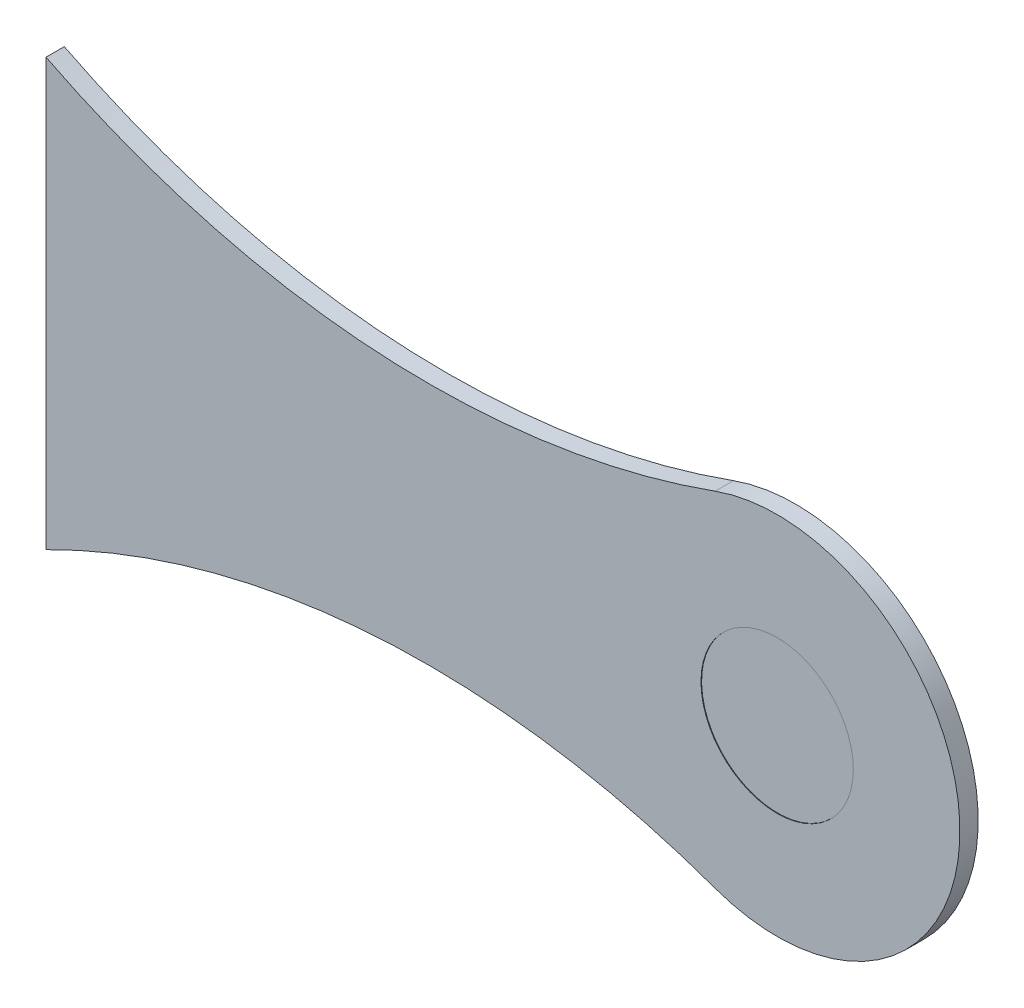
ISO-10303-21;
HEADER;
FILE_DESCRIPTION(('STEP AP214'),'2;1');
FILE_NAME('part.step','',(''),(''),'','','');
FILE_SCHEMA(('AUTOMOTIVE_DESIGN { 1 0 10303 214 1 1 1 1 }'));
ENDSEC;
DATA;
#1=APPLICATION_CONTEXT('core data for automotive mechanical design processes');
#2=APPLICATION_PROTOCOL_DEFINITION('international standard','automotive_design',2000,#1);
#3=PRODUCT_CONTEXT('',#1,'mechanical');
#4=PRODUCT('Part','Part','',(#3));
#5=PRODUCT_RELATED_PRODUCT_CATEGORY('part','',(#4));
#6=PRODUCT_DEFINITION_FORMATION('','',#4);
#7=PRODUCT_DEFINITION_CONTEXT('part definition',#1,'design');
#8=PRODUCT_DEFINITION('design','',#6,#7);
#9=PRODUCT_DEFINITION_SHAPE('','',#8);
#10=(LENGTH_UNIT() NAMED_UNIT(*) SI_UNIT(.MILLI.,.METRE.));
#11=(NAMED_UNIT(*) PLANE_ANGLE_UNIT() SI_UNIT($,.RADIAN.));
#12=(NAMED_UNIT(*) SI_UNIT($,.STERADIAN.) SOLID_ANGLE_UNIT());
#13=UNCERTAINTY_MEASURE_WITH_UNIT(LENGTH_MEASURE(1.E-05),#10,'distance_accuracy_value','');
#14=(GEOMETRIC_REPRESENTATION_CONTEXT(3) GLOBAL_UNCERTAINTY_ASSIGNED_CONTEXT((#13)) GLOBAL_UNIT_ASSIGNED_CONTEXT((#10,
#11,#12)) REPRESENTATION_CONTEXT('',''));
#15=CARTESIAN_POINT('',(0.,0.,0.));
#16=DIRECTION('',(0.,0.,1.));
#17=DIRECTION('',(1.,0.,0.));
#18=AXIS2_PLACEMENT_3D('',#15,#16,#17);
#19=CARTESIAN_POINT('',(0.,0.,1.5));
#20=DIRECTION('',(0.,0.,-1.));
#21=DIRECTION('',(0.,1.,0.));
#22=AXIS2_PLACEMENT_3D('',#19,#20,#21);
#23=CYLINDRICAL_SURFACE('',#22,12.5);
#24=CARTESIAN_POINT('',(0.,0.,1.5));
#25=DIRECTION('',(0.,0.,1.));
#26=DIRECTION('',(0.,-1.,0.));
#27=AXIS2_PLACEMENT_3D('',#24,#25,#26);
#28=CIRCLE('',#27,12.5);
#29=CARTESIAN_POINT('',(0.,-12.5,1.49999999999996));
#30=VERTEX_POINT('',#29);
#31=EDGE_CURVE('E120',#30,#30,#28,.T.);
#32=ORIENTED_EDGE('',*,*,#31,.T.);
#33=EDGE_LOOP('',(#32));
#34=FACE_BOUND('',#33,.T.);
#35=CARTESIAN_POINT('',(0.,0.,1.4));
#36=DIRECTION('',(0.,0.,-1.));
#37=DIRECTION('',(0.,1.,0.));
#38=AXIS2_PLACEMENT_3D('',#35,#36,#37);
#39=CIRCLE('',#38,12.5);
#40=CARTESIAN_POINT('',(0.,12.5,1.40000000000004));
#41=VERTEX_POINT('',#40);
#42=EDGE_CURVE('E136',#41,#41,#39,.T.);
#43=ORIENTED_EDGE('',*,*,#42,.T.);
#44=EDGE_LOOP('',(#43));
#45=FACE_BOUND('',#44,.T.);
#46=ADVANCED_FACE('F49',(#34,#45),#23,.F.);
#47=CARTESIAN_POINT('',(-57.237278954037,158.805305103112,1.50000000000055));
#48=DIRECTION('',(0.,0.,-1.));
#49=DIRECTION('',(0.,1.,0.));
#50=AXIS2_PLACEMENT_3D('',#47,#48,#49);
#51=PLANE('',#50);
#52=CARTESIAN_POINT('',(-57.237278954037,158.805305103112,1.50000000000055));
#53=DIRECTION('',(0.,0.,-1.));
#54=DIRECTION('',(0.,1.,0.));
#55=AXIS2_PLACEMENT_3D('',#52,#53,#54);
#56=CIRCLE('',#55,138.805305103112);
#57=CARTESIAN_POINT('',(-10.1721824890055,28.2228046694578,1.5000000000001));
#58=VERTEX_POINT('',#57);
#59=CARTESIAN_POINT('',(-120.,35.,1.50000000000012));
#60=VERTEX_POINT('',#59);
#61=EDGE_CURVE('E103',#58,#60,#56,.T.);
#62=ORIENTED_EDGE('',*,*,#61,.T.);
#63=DIRECTION('',(0.,-1.,0.));
#64=VECTOR('',#63,1.);
#65=CARTESIAN_POINT('',(-120.,35.,1.50000000000012));
#66=LINE('',#65,#64);
#67=CARTESIAN_POINT('',(-120.,-35.,1.49999999999988));
#68=VERTEX_POINT('',#67);
#69=EDGE_CURVE('E97',#60,#68,#66,.T.);
#70=ORIENTED_EDGE('',*,*,#69,.T.);
#71=CARTESIAN_POINT('',(-57.237278954037,-158.805305103112,1.49999999999945));
#72=DIRECTION('',(0.,0.,-1.));
#73=DIRECTION('',(0.,-1.,0.));
#74=AXIS2_PLACEMENT_3D('',#71,#72,#73);
#75=CIRCLE('',#74,138.805305103112);
#76=CARTESIAN_POINT('',(-10.1721824890055,-28.2228046694578,1.4999999999999));
#77=VERTEX_POINT('',#76);
#78=EDGE_CURVE('E101',#68,#77,#75,.T.);
#79=ORIENTED_EDGE('',*,*,#78,.T.);
#80=CARTESIAN_POINT('',(0.,0.,1.5));
#81=DIRECTION('',(0.,0.,1.));
#82=DIRECTION('',(0.,1.,0.));
#83=AXIS2_PLACEMENT_3D('',#80,#81,#82);
#84=CIRCLE('',#83,30.);
#85=EDGE_CURVE('E66',#77,#58,#84,.T.);
#86=ORIENTED_EDGE('',*,*,#85,.T.);
#87=EDGE_LOOP('',(#62,#70,#79,#86));
#88=FACE_BOUND('',#87,.T.);
#89=ORIENTED_EDGE('',*,*,#31,.F.);
#90=EDGE_LOOP('',(#89));
#91=FACE_BOUND('',#90,.T.);
#92=ADVANCED_FACE('F98',(#88,#91),#51,.F.);
#93=CARTESIAN_POINT('',(-57.237278954037,158.805305103112,-1.49999999999945));
#94=DIRECTION('',(0.,0.,-1.));
#95=DIRECTION('',(0.,1.,0.));
#96=AXIS2_PLACEMENT_3D('',#93,#94,#95);
#97=PLANE('',#96);
#98=CARTESIAN_POINT('',(-57.237278954037,158.805305103112,-1.49999999999945));
#99=DIRECTION('',(0.,0.,-1.));
#100=DIRECTION('',(0.,1.,0.));
#101=AXIS2_PLACEMENT_3D('',#98,#99,#100);
#102=CIRCLE('',#101,138.805305103112);
#103=CARTESIAN_POINT('',(-10.1721824890055,28.2228046694578,-1.4999999999999));
#104=VERTEX_POINT('',#103);
#105=CARTESIAN_POINT('',(-120.,35.,-1.49999999999988));
#106=VERTEX_POINT('',#105);
#107=EDGE_CURVE('E117',#104,#106,#102,.T.);
#108=ORIENTED_EDGE('',*,*,#107,.F.);
#109=CARTESIAN_POINT('',(0.,0.,-1.5));
#110=DIRECTION('',(0.,0.,1.));
#111=DIRECTION('',(0.,1.,0.));
#112=AXIS2_PLACEMENT_3D('',#109,#110,#111);
#113=CIRCLE('',#112,30.);
#114=CARTESIAN_POINT('',(-10.1721824890055,-28.2228046694578,-1.5000000000001));
#115=VERTEX_POINT('',#114);
#116=EDGE_CURVE('E89',#115,#104,#113,.T.);
#117=ORIENTED_EDGE('',*,*,#116,.F.);
#118=CARTESIAN_POINT('',(-57.237278954037,-158.805305103112,-1.50000000000055));
#119=DIRECTION('',(0.,0.,-1.));
#120=DIRECTION('',(0.,-1.,0.));
#121=AXIS2_PLACEMENT_3D('',#118,#119,#120);
#122=CIRCLE('',#121,138.805305103112);
#123=CARTESIAN_POINT('',(-120.,-35.,-1.50000000000012));
#124=VERTEX_POINT('',#123);
#125=EDGE_CURVE('E83',#124,#115,#122,.T.);
#126=ORIENTED_EDGE('',*,*,#125,.F.);
#127=DIRECTION('',(0.,-1.,0.));
#128=VECTOR('',#127,1.);
#129=CARTESIAN_POINT('',(-120.,35.,-1.49999999999988));
#130=LINE('',#129,#128);
#131=EDGE_CURVE('E108',#106,#124,#130,.T.);
#132=ORIENTED_EDGE('',*,*,#131,.F.);
#133=EDGE_LOOP('',(#108,#117,#126,#132));
#134=FACE_BOUND('',#133,.T.);
#135=CARTESIAN_POINT('',(0.,0.,-1.5));
#136=DIRECTION('',(0.,0.,1.));
#137=DIRECTION('',(0.,-1.,0.));
#138=AXIS2_PLACEMENT_3D('',#135,#136,#137);
#139=CIRCLE('',#138,12.5);
#140=CARTESIAN_POINT('',(0.,-12.5,-1.50000000000004));
#141=VERTEX_POINT('',#140);
#142=EDGE_CURVE('E134',#141,#141,#139,.T.);
#143=ORIENTED_EDGE('',*,*,#142,.T.);
#144=EDGE_LOOP('',(#143));
#145=FACE_BOUND('',#144,.T.);
#146=ADVANCED_FACE('F128',(#134,#145),#97,.T.);
#147=CARTESIAN_POINT('',(-57.237278954037,158.805305103112,1.50000000000055));
#148=DIRECTION('',(0.,0.,-1.));
#149=DIRECTION('',(0.,1.,0.));
#150=AXIS2_PLACEMENT_3D('',#147,#148,#149);
#151=CYLINDRICAL_SURFACE('',#150,138.805305103112);
#152=ORIENTED_EDGE('',*,*,#107,.T.);
#153=DIRECTION('',(0.,0.,-1.));
#154=VECTOR('',#153,1.);
#155=CARTESIAN_POINT('',(-120.,35.,1.50000000000012));
#156=LINE('',#155,#154);
#157=EDGE_CURVE('E58',#60,#106,#156,.T.);
#158=ORIENTED_EDGE('',*,*,#157,.F.);
#159=ORIENTED_EDGE('',*,*,#61,.F.);
#160=DIRECTION('',(0.,0.,-1.));
#161=VECTOR('',#160,1.);
#162=CARTESIAN_POINT('',(-10.1721824890055,28.2228046694578,1.5000000000001));
#163=LINE('',#162,#161);
#164=EDGE_CURVE('E113',#58,#104,#163,.T.);
#165=ORIENTED_EDGE('',*,*,#164,.T.);
#166=EDGE_LOOP('',(#152,#158,#159,#165));
#167=FACE_BOUND('',#166,.T.);
#168=ADVANCED_FACE('F51',(#167),#151,.F.);
#169=CARTESIAN_POINT('',(-120.,35.,1.50000000000012));
#170=DIRECTION('',(1.,0.,0.));
#171=DIRECTION('',(0.,1.,0.));
#172=AXIS2_PLACEMENT_3D('',#169,#170,#171);
#173=PLANE('',#172);
#174=ORIENTED_EDGE('',*,*,#131,.T.);
#175=DIRECTION('',(0.,0.,-1.));
#176=VECTOR('',#175,1.);
#177=CARTESIAN_POINT('',(-120.,-35.,1.49999999999988));
#178=LINE('',#177,#176);
#179=EDGE_CURVE('E106',#68,#124,#178,.T.);
#180=ORIENTED_EDGE('',*,*,#179,.F.);
#181=ORIENTED_EDGE('',*,*,#69,.F.);
#182=ORIENTED_EDGE('',*,*,#157,.T.);
#183=EDGE_LOOP('',(#174,#180,#181,#182));
#184=FACE_BOUND('',#183,.T.);
#185=ADVANCED_FACE('F107',(#184),#173,.F.);
#186=CARTESIAN_POINT('',(-57.237278954037,-158.805305103112,1.49999999999945));
#187=DIRECTION('',(0.,0.,-1.));
#188=DIRECTION('',(0.,1.,0.));
#189=AXIS2_PLACEMENT_3D('',#186,#187,#188);
#190=CYLINDRICAL_SURFACE('',#189,138.805305103112);
#191=ORIENTED_EDGE('',*,*,#125,.T.);
#192=DIRECTION('',(0.,0.,-1.));
#193=VECTOR('',#192,1.);
#194=CARTESIAN_POINT('',(-10.1721824890055,-28.2228046694578,1.4999999999999));
#195=LINE('',#194,#193);
#196=EDGE_CURVE('E109',#77,#115,#195,.T.);
#197=ORIENTED_EDGE('',*,*,#196,.F.);
#198=ORIENTED_EDGE('',*,*,#78,.F.);
#199=ORIENTED_EDGE('',*,*,#179,.T.);
#200=EDGE_LOOP('',(#191,#197,#198,#199));
#201=FACE_BOUND('',#200,.T.);
#202=ADVANCED_FACE('F111',(#201),#190,.F.);
#203=CARTESIAN_POINT('',(0.,0.,1.5));
#204=DIRECTION('',(0.,0.,-1.));
#205=DIRECTION('',(0.,1.,0.));
#206=AXIS2_PLACEMENT_3D('',#203,#204,#205);
#207=CYLINDRICAL_SURFACE('',#206,30.);
#208=ORIENTED_EDGE('',*,*,#116,.T.);
#209=ORIENTED_EDGE('',*,*,#164,.F.);
#210=ORIENTED_EDGE('',*,*,#85,.F.);
#211=ORIENTED_EDGE('',*,*,#196,.T.);
#212=EDGE_LOOP('',(#208,#209,#210,#211));
#213=FACE_BOUND('',#212,.T.);
#214=ADVANCED_FACE('F163',(#213),#207,.T.);
#215=CARTESIAN_POINT('',(0.,0.,-1.4));
#216=DIRECTION('',(0.,0.,-1.));
#217=DIRECTION('',(0.,1.,0.));
#218=AXIS2_PLACEMENT_3D('',#215,#216,#217);
#219=CIRCLE('',#218,12.5);
#220=CARTESIAN_POINT('',(0.,12.5,-1.39999999999996));
#221=VERTEX_POINT('',#220);
#222=EDGE_CURVE('E12',#221,#221,#219,.T.);
#223=ORIENTED_EDGE('',*,*,#222,.F.);
#224=EDGE_LOOP('',(#223));
#225=FACE_BOUND('',#224,.T.);
#226=ORIENTED_EDGE('',*,*,#142,.F.);
#227=EDGE_LOOP('',(#226));
#228=FACE_BOUND('',#227,.T.);
#229=ADVANCED_FACE('F152',(#225,#228),#23,.F.);
#230=CARTESIAN_POINT('',(-57.237278954037,158.805305103112,-1.39999999999945));
#231=DIRECTION('',(0.,0.,-1.));
#232=DIRECTION('',(0.,1.,0.));
#233=AXIS2_PLACEMENT_3D('',#230,#231,#232);
#234=PLANE('',#233);
#235=ORIENTED_EDGE('',*,*,#222,.T.);
#236=EDGE_LOOP('',(#235));
#237=FACE_BOUND('',#236,.T.);
#238=ADVANCED_FACE('F147',(#237),#234,.T.);
#239=CARTESIAN_POINT('',(-57.237278954037,158.805305103112,1.40000000000055));
#240=DIRECTION('',(0.,0.,-1.));
#241=DIRECTION('',(0.,1.,0.));
#242=AXIS2_PLACEMENT_3D('',#239,#240,#241);
#243=PLANE('',#242);
#244=ORIENTED_EDGE('',*,*,#42,.F.);
#245=EDGE_LOOP('',(#244));
#246=FACE_BOUND('',#245,.T.);
#247=ADVANCED_FACE('F145',(#246),#243,.F.);
#248=CLOSED_SHELL('',(#46,#92,#146,#168,#185,#202,#214,#229,#238,#247));
#249=MANIFOLD_SOLID_BREP('B2',#248);
#250=ADVANCED_BREP_SHAPE_REPRESENTATION('',(#18,#249),#14);
#251=SHAPE_DEFINITION_REPRESENTATION(#9,#250);
ENDSEC;
END-ISO-10303-21;
